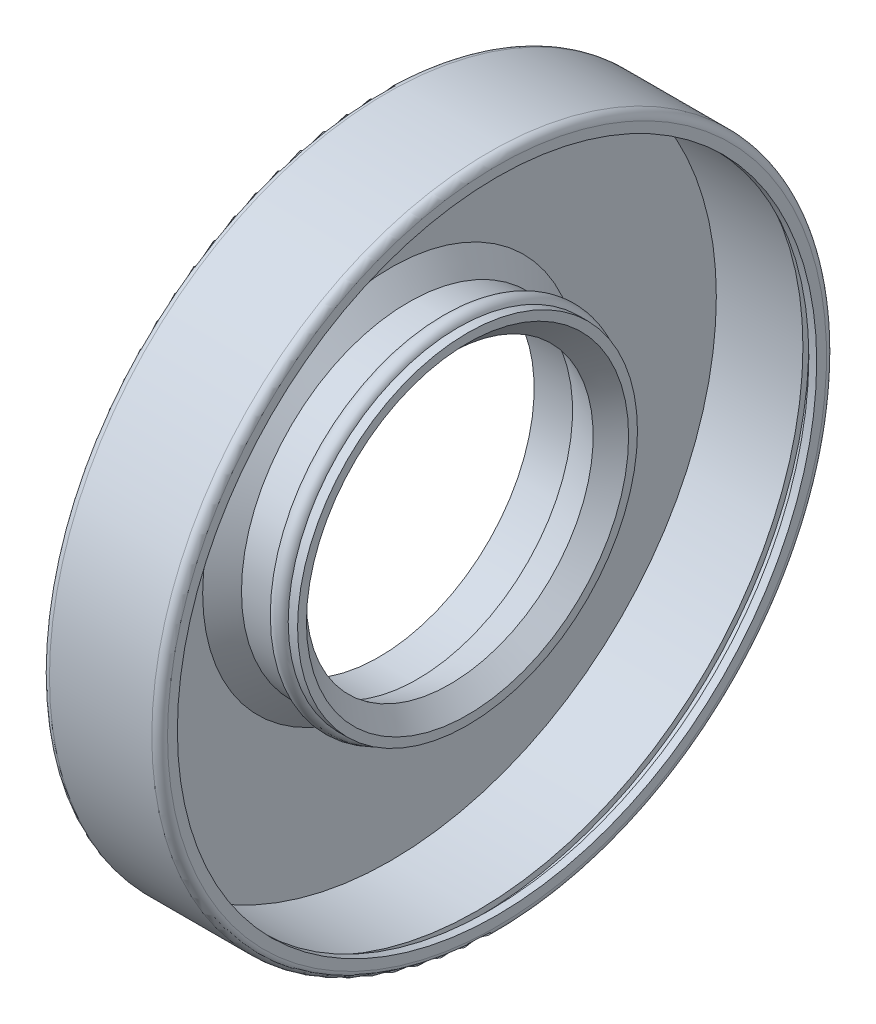
ISO-10303-21;
HEADER;
FILE_DESCRIPTION(('STEP AP214'),'2;1');
FILE_NAME('part.step','',(''),(''),'','','');
FILE_SCHEMA(('AUTOMOTIVE_DESIGN { 1 0 10303 214 1 1 1 1 }'));
ENDSEC;
DATA;
#1=APPLICATION_CONTEXT('core data for automotive mechanical design processes');
#2=APPLICATION_PROTOCOL_DEFINITION('international standard','automotive_design',2000,#1);
#3=PRODUCT_CONTEXT('',#1,'mechanical');
#4=PRODUCT('Part','Part','',(#3));
#5=PRODUCT_RELATED_PRODUCT_CATEGORY('part','',(#4));
#6=PRODUCT_DEFINITION_FORMATION('','',#4);
#7=PRODUCT_DEFINITION_CONTEXT('part definition',#1,'design');
#8=PRODUCT_DEFINITION('design','',#6,#7);
#9=PRODUCT_DEFINITION_SHAPE('','',#8);
#10=(LENGTH_UNIT() NAMED_UNIT(*) SI_UNIT(.MILLI.,.METRE.));
#11=(NAMED_UNIT(*) PLANE_ANGLE_UNIT() SI_UNIT($,.RADIAN.));
#12=(NAMED_UNIT(*) SI_UNIT($,.STERADIAN.) SOLID_ANGLE_UNIT());
#13=UNCERTAINTY_MEASURE_WITH_UNIT(LENGTH_MEASURE(1.E-05),#10,'distance_accuracy_value','');
#14=(GEOMETRIC_REPRESENTATION_CONTEXT(3) GLOBAL_UNCERTAINTY_ASSIGNED_CONTEXT((#13)) GLOBAL_UNIT_ASSIGNED_CONTEXT((#10,
#11,#12)) REPRESENTATION_CONTEXT('',''));
#15=CARTESIAN_POINT('',(0.,0.,0.));
#16=DIRECTION('',(0.,0.,1.));
#17=DIRECTION('',(1.,0.,0.));
#18=AXIS2_PLACEMENT_3D('',#15,#16,#17);
#19=CARTESIAN_POINT('',(0.,0.,-9.2));
#20=DIRECTION('',(1.,0.,0.));
#21=DIRECTION('',(0.,0.,-1.));
#22=AXIS2_PLACEMENT_3D('',#19,#20,#21);
#23=PLANE('',#22);
#24=CARTESIAN_POINT('',(0.,0.,0.));
#25=DIRECTION('',(-1.,0.,0.));
#26=DIRECTION('',(0.,0.,1.));
#27=AXIS2_PLACEMENT_3D('',#24,#25,#26);
#28=CIRCLE('',#27,19.5333333333333);
#29=CARTESIAN_POINT('',(0.,0.,19.5333333333333));
#30=VERTEX_POINT('',#29);
#31=EDGE_CURVE('E70',#30,#30,#28,.T.);
#32=ORIENTED_EDGE('',*,*,#31,.T.);
#33=EDGE_LOOP('',(#32));
#34=FACE_BOUND('',#33,.T.);
#35=CARTESIAN_POINT('',(0.,0.,0.));
#36=DIRECTION('',(1.,0.,0.));
#37=DIRECTION('',(0.,0.,-1.));
#38=AXIS2_PLACEMENT_3D('',#35,#36,#37);
#39=CIRCLE('',#38,9.55);
#40=CARTESIAN_POINT('',(0.,0.,-9.55));
#41=VERTEX_POINT('',#40);
#42=EDGE_CURVE('E10',#41,#41,#39,.F.);
#43=ORIENTED_EDGE('',*,*,#42,.F.);
#44=EDGE_LOOP('',(#43));
#45=FACE_BOUND('',#44,.T.);
#46=ADVANCED_FACE('F32',(#34,#45),#23,.F.);
#47=CARTESIAN_POINT('',(0.,0.,0.));
#48=DIRECTION('',(-1.,0.,0.));
#49=DIRECTION('',(0.,0.,1.));
#50=AXIS2_PLACEMENT_3D('',#47,#48,#49);
#51=CYLINDRICAL_SURFACE('',#50,19.3);
#52=CARTESIAN_POINT('',(5.83333333333334,0.,0.));
#53=DIRECTION('',(-1.,0.,0.));
#54=DIRECTION('',(0.,0.,1.));
#55=AXIS2_PLACEMENT_3D('',#52,#53,#54);
#56=CIRCLE('',#55,19.3);
#57=CARTESIAN_POINT('',(5.83333333333334,0.,19.3));
#58=VERTEX_POINT('',#57);
#59=EDGE_CURVE('E40',#58,#58,#56,.T.);
#60=ORIENTED_EDGE('',*,*,#59,.F.);
#61=EDGE_LOOP('',(#60));
#62=FACE_BOUND('',#61,.T.);
#63=CARTESIAN_POINT('',(0.699999999999999,0.,0.));
#64=DIRECTION('',(-1.,0.,0.));
#65=DIRECTION('',(0.,0.,1.));
#66=AXIS2_PLACEMENT_3D('',#63,#64,#65);
#67=CIRCLE('',#66,19.3);
#68=CARTESIAN_POINT('',(0.699999999999999,0.,19.3));
#69=VERTEX_POINT('',#68);
#70=EDGE_CURVE('E100',#69,#69,#67,.T.);
#71=ORIENTED_EDGE('',*,*,#70,.T.);
#72=EDGE_LOOP('',(#71));
#73=FACE_BOUND('',#72,.T.);
#74=ADVANCED_FACE('F34',(#62,#73),#51,.F.);
#75=CARTESIAN_POINT('',(5.83333333333334,0.,-19.3));
#76=DIRECTION('',(-1.,0.,0.));
#77=DIRECTION('',(0.,0.,1.));
#78=AXIS2_PLACEMENT_3D('',#75,#76,#77);
#79=PLANE('',#78);
#80=CARTESIAN_POINT('',(5.83333333333334,0.,0.));
#81=DIRECTION('',(-1.,0.,0.));
#82=DIRECTION('',(0.,0.,1.));
#83=AXIS2_PLACEMENT_3D('',#80,#81,#82);
#84=CIRCLE('',#83,19.65);
#85=CARTESIAN_POINT('',(5.83333333333334,0.,19.65));
#86=VERTEX_POINT('',#85);
#87=EDGE_CURVE('E46',#86,#86,#84,.T.);
#88=ORIENTED_EDGE('',*,*,#87,.F.);
#89=EDGE_LOOP('',(#88));
#90=FACE_BOUND('',#89,.T.);
#91=ORIENTED_EDGE('',*,*,#59,.T.);
#92=EDGE_LOOP('',(#91));
#93=FACE_BOUND('',#92,.T.);
#94=ADVANCED_FACE('F174',(#90,#93),#79,.F.);
#95=CARTESIAN_POINT('',(0.,0.,0.));
#96=DIRECTION('',(-1.,0.,0.));
#97=DIRECTION('',(0.,0.,1.));
#98=AXIS2_PLACEMENT_3D('',#95,#96,#97);
#99=CYLINDRICAL_SURFACE('',#98,19.65);
#100=CARTESIAN_POINT('',(6.53333333333333,0.,0.));
#101=DIRECTION('',(-1.,0.,0.));
#102=DIRECTION('',(0.,0.,1.));
#103=AXIS2_PLACEMENT_3D('',#100,#101,#102);
#104=CIRCLE('',#103,19.65);
#105=CARTESIAN_POINT('',(6.53333333333333,0.,19.65));
#106=VERTEX_POINT('',#105);
#107=EDGE_CURVE('E50',#106,#106,#104,.T.);
#108=ORIENTED_EDGE('',*,*,#107,.F.);
#109=EDGE_LOOP('',(#108));
#110=FACE_BOUND('',#109,.T.);
#111=ORIENTED_EDGE('',*,*,#87,.T.);
#112=EDGE_LOOP('',(#111));
#113=FACE_BOUND('',#112,.T.);
#114=ADVANCED_FACE('F207',(#110,#113),#99,.F.);
#115=CARTESIAN_POINT('',(6.53333333333333,0.,-19.65));
#116=DIRECTION('',(1.,0.,0.));
#117=DIRECTION('',(0.,0.,-1.));
#118=AXIS2_PLACEMENT_3D('',#115,#116,#117);
#119=PLANE('',#118);
#120=CARTESIAN_POINT('',(6.53333333333333,0.,0.));
#121=DIRECTION('',(-1.,0.,0.));
#122=DIRECTION('',(0.,0.,1.));
#123=AXIS2_PLACEMENT_3D('',#120,#121,#122);
#124=CIRCLE('',#123,18.95);
#125=CARTESIAN_POINT('',(6.53333333333333,0.,18.95));
#126=VERTEX_POINT('',#125);
#127=EDGE_CURVE('E55',#126,#126,#124,.T.);
#128=ORIENTED_EDGE('',*,*,#127,.F.);
#129=EDGE_LOOP('',(#128));
#130=FACE_BOUND('',#129,.T.);
#131=ORIENTED_EDGE('',*,*,#107,.T.);
#132=EDGE_LOOP('',(#131));
#133=FACE_BOUND('',#132,.T.);
#134=ADVANCED_FACE('F201',(#130,#133),#119,.F.);
#135=CARTESIAN_POINT('',(0.,0.,0.));
#136=DIRECTION('',(-1.,0.,0.));
#137=DIRECTION('',(0.,0.,1.));
#138=AXIS2_PLACEMENT_3D('',#135,#136,#137);
#139=CYLINDRICAL_SURFACE('',#138,18.95);
#140=CARTESIAN_POINT('',(7.,0.,0.));
#141=DIRECTION('',(-1.,0.,0.));
#142=DIRECTION('',(0.,0.,1.));
#143=AXIS2_PLACEMENT_3D('',#140,#141,#142);
#144=CIRCLE('',#143,18.95);
#145=CARTESIAN_POINT('',(7.,0.,18.95));
#146=VERTEX_POINT('',#145);
#147=EDGE_CURVE('E58',#146,#146,#144,.T.);
#148=ORIENTED_EDGE('',*,*,#147,.F.);
#149=EDGE_LOOP('',(#148));
#150=FACE_BOUND('',#149,.T.);
#151=ORIENTED_EDGE('',*,*,#127,.T.);
#152=EDGE_LOOP('',(#151));
#153=FACE_BOUND('',#152,.T.);
#154=ADVANCED_FACE('F195',(#150,#153),#139,.F.);
#155=CARTESIAN_POINT('',(7.,0.,-18.95));
#156=DIRECTION('',(-1.,0.,0.));
#157=DIRECTION('',(0.,0.,1.));
#158=AXIS2_PLACEMENT_3D('',#155,#156,#157);
#159=PLANE('',#158);
#160=CARTESIAN_POINT('',(7.,0.,0.));
#161=DIRECTION('',(-1.,0.,0.));
#162=DIRECTION('',(0.,0.,1.));
#163=AXIS2_PLACEMENT_3D('',#160,#161,#162);
#164=CIRCLE('',#163,19.5333333333333);
#165=CARTESIAN_POINT('',(7.,0.,19.5333333333333));
#166=VERTEX_POINT('',#165);
#167=EDGE_CURVE('E61',#166,#166,#164,.T.);
#168=ORIENTED_EDGE('',*,*,#167,.F.);
#169=EDGE_LOOP('',(#168));
#170=FACE_BOUND('',#169,.T.);
#171=ORIENTED_EDGE('',*,*,#147,.T.);
#172=EDGE_LOOP('',(#171));
#173=FACE_BOUND('',#172,.T.);
#174=ADVANCED_FACE('F189',(#170,#173),#159,.F.);
#175=CARTESIAN_POINT('',(6.53333333333333,0.,0.));
#176=DIRECTION('',(-1.,0.,0.));
#177=DIRECTION('',(0.,0.,1.));
#178=AXIS2_PLACEMENT_3D('',#175,#176,#177);
#179=TOROIDAL_SURFACE('',#178,19.5333333333333,0.466666666666669);
#180=CARTESIAN_POINT('',(6.53333333333333,0.,0.));
#181=DIRECTION('',(-1.,0.,0.));
#182=DIRECTION('',(0.,0.,1.));
#183=AXIS2_PLACEMENT_3D('',#180,#181,#182);
#184=CIRCLE('',#183,20.);
#185=CARTESIAN_POINT('',(6.53333333333333,0.,20.));
#186=VERTEX_POINT('',#185);
#187=EDGE_CURVE('E64',#186,#186,#184,.T.);
#188=ORIENTED_EDGE('',*,*,#187,.F.);
#189=EDGE_LOOP('',(#188));
#190=FACE_BOUND('',#189,.T.);
#191=ORIENTED_EDGE('',*,*,#167,.T.);
#192=EDGE_LOOP('',(#191));
#193=FACE_BOUND('',#192,.T.);
#194=ADVANCED_FACE('F183',(#190,#193),#179,.T.);
#195=CARTESIAN_POINT('',(0.,0.,0.));
#196=DIRECTION('',(-1.,0.,0.));
#197=DIRECTION('',(0.,0.,1.));
#198=AXIS2_PLACEMENT_3D('',#195,#196,#197);
#199=CYLINDRICAL_SURFACE('',#198,20.);
#200=CARTESIAN_POINT('',(0.466666666666664,0.,0.));
#201=DIRECTION('',(-1.,0.,0.));
#202=DIRECTION('',(0.,0.,1.));
#203=AXIS2_PLACEMENT_3D('',#200,#201,#202);
#204=CIRCLE('',#203,20.);
#205=CARTESIAN_POINT('',(0.466666666666664,0.,20.));
#206=VERTEX_POINT('',#205);
#207=EDGE_CURVE('E67',#206,#206,#204,.T.);
#208=ORIENTED_EDGE('',*,*,#207,.F.);
#209=EDGE_LOOP('',(#208));
#210=FACE_BOUND('',#209,.T.);
#211=ORIENTED_EDGE('',*,*,#187,.T.);
#212=EDGE_LOOP('',(#211));
#213=FACE_BOUND('',#212,.T.);
#214=ADVANCED_FACE('F166',(#210,#213),#199,.T.);
#215=CARTESIAN_POINT('',(0.466666666666664,0.,0.));
#216=DIRECTION('',(-1.,0.,0.));
#217=DIRECTION('',(0.,0.,1.));
#218=AXIS2_PLACEMENT_3D('',#215,#216,#217);
#219=TOROIDAL_SURFACE('',#218,19.5333333333333,0.466666666666665);
#220=ORIENTED_EDGE('',*,*,#31,.F.);
#221=EDGE_LOOP('',(#220));
#222=FACE_BOUND('',#221,.T.);
#223=ORIENTED_EDGE('',*,*,#207,.T.);
#224=EDGE_LOOP('',(#223));
#225=FACE_BOUND('',#224,.T.);
#226=ADVANCED_FACE('F161',(#222,#225),#219,.T.);
#227=ORIENTED_EDGE('',*,*,#42,.T.);
#228=EDGE_LOOP('',(#227));
#229=FACE_BOUND('',#228,.T.);
#230=CARTESIAN_POINT('',(0.,0.,0.));
#231=DIRECTION('',(-1.,0.,0.));
#232=DIRECTION('',(0.,0.,1.));
#233=AXIS2_PLACEMENT_3D('',#230,#231,#232);
#234=CIRCLE('',#233,9.2);
#235=CARTESIAN_POINT('',(0.,0.,9.2));
#236=VERTEX_POINT('',#235);
#237=EDGE_CURVE('E73',#236,#236,#234,.T.);
#238=ORIENTED_EDGE('',*,*,#237,.F.);
#239=EDGE_LOOP('',(#238));
#240=FACE_BOUND('',#239,.T.);
#241=ADVANCED_FACE('F156',(#229,#240),#23,.F.);
#242=CARTESIAN_POINT('',(0.,0.,0.));
#243=DIRECTION('',(-1.,0.,0.));
#244=DIRECTION('',(0.,0.,1.));
#245=AXIS2_PLACEMENT_3D('',#242,#243,#244);
#246=CYLINDRICAL_SURFACE('',#245,9.2);
#247=CARTESIAN_POINT('',(2.27676580638177,0.,0.));
#248=DIRECTION('',(-1.,0.,0.));
#249=DIRECTION('',(0.,0.,1.));
#250=AXIS2_PLACEMENT_3D('',#247,#248,#249);
#251=CIRCLE('',#250,9.2);
#252=CARTESIAN_POINT('',(2.27676580638177,0.,9.2));
#253=VERTEX_POINT('',#252);
#254=EDGE_CURVE('E76',#253,#253,#251,.T.);
#255=ORIENTED_EDGE('',*,*,#254,.F.);
#256=EDGE_LOOP('',(#255));
#257=FACE_BOUND('',#256,.T.);
#258=ORIENTED_EDGE('',*,*,#237,.T.);
#259=EDGE_LOOP('',(#258));
#260=FACE_BOUND('',#259,.T.);
#261=ADVANCED_FACE('F150',(#257,#260),#246,.F.);
#262=CARTESIAN_POINT('',(2.27676580638177,0.,0.));
#263=DIRECTION('',(-1.,0.,0.));
#264=DIRECTION('',(0.,0.,1.));
#265=AXIS2_PLACEMENT_3D('',#262,#263,#264);
#266=CONICAL_SURFACE('',#265,9.2,0.349065850398866);
#267=CARTESIAN_POINT('',(4.2,0.,0.));
#268=DIRECTION('',(-1.,0.,0.));
#269=DIRECTION('',(0.,0.,1.));
#270=AXIS2_PLACEMENT_3D('',#267,#268,#269);
#271=CIRCLE('',#270,8.5);
#272=CARTESIAN_POINT('',(4.2,0.,8.5));
#273=VERTEX_POINT('',#272);
#274=EDGE_CURVE('E79',#273,#273,#271,.T.);
#275=ORIENTED_EDGE('',*,*,#274,.F.);
#276=EDGE_LOOP('',(#275));
#277=FACE_BOUND('',#276,.T.);
#278=ORIENTED_EDGE('',*,*,#254,.T.);
#279=EDGE_LOOP('',(#278));
#280=FACE_BOUND('',#279,.T.);
#281=ADVANCED_FACE('F144',(#277,#280),#266,.F.);
#282=CARTESIAN_POINT('',(4.2,0.,0.));
#283=DIRECTION('',(1.,0.,0.));
#284=DIRECTION('',(0.,0.,-1.));
#285=AXIS2_PLACEMENT_3D('',#282,#283,#284);
#286=CONICAL_SURFACE('',#285,8.5,0.78539816339745);
#287=CARTESIAN_POINT('',(5.25,0.,0.));
#288=DIRECTION('',(-1.,0.,0.));
#289=DIRECTION('',(0.,0.,1.));
#290=AXIS2_PLACEMENT_3D('',#287,#288,#289);
#291=CIRCLE('',#290,9.55);
#292=CARTESIAN_POINT('',(5.25,0.,9.55));
#293=VERTEX_POINT('',#292);
#294=EDGE_CURVE('E82',#293,#293,#291,.T.);
#295=ORIENTED_EDGE('',*,*,#294,.F.);
#296=EDGE_LOOP('',(#295));
#297=FACE_BOUND('',#296,.T.);
#298=ORIENTED_EDGE('',*,*,#274,.T.);
#299=EDGE_LOOP('',(#298));
#300=FACE_BOUND('',#299,.T.);
#301=ADVANCED_FACE('F138',(#297,#300),#286,.F.);
#302=CARTESIAN_POINT('',(5.25,0.,-9.55));
#303=DIRECTION('',(-1.,0.,0.));
#304=DIRECTION('',(0.,0.,1.));
#305=AXIS2_PLACEMENT_3D('',#302,#303,#304);
#306=PLANE('',#305);
#307=CARTESIAN_POINT('',(5.25,0.,0.));
#308=DIRECTION('',(-1.,0.,0.));
#309=DIRECTION('',(0.,0.,1.));
#310=AXIS2_PLACEMENT_3D('',#307,#308,#309);
#311=CIRCLE('',#310,10.075);
#312=CARTESIAN_POINT('',(5.25,0.,10.075));
#313=VERTEX_POINT('',#312);
#314=EDGE_CURVE('E85',#313,#313,#311,.T.);
#315=ORIENTED_EDGE('',*,*,#314,.F.);
#316=EDGE_LOOP('',(#315));
#317=FACE_BOUND('',#316,.T.);
#318=ORIENTED_EDGE('',*,*,#294,.T.);
#319=EDGE_LOOP('',(#318));
#320=FACE_BOUND('',#319,.T.);
#321=ADVANCED_FACE('F132',(#317,#320),#306,.F.);
#322=CARTESIAN_POINT('',(0.,0.,0.));
#323=DIRECTION('',(-1.,0.,0.));
#324=DIRECTION('',(0.,0.,1.));
#325=AXIS2_PLACEMENT_3D('',#322,#323,#324);
#326=CYLINDRICAL_SURFACE('',#325,10.075);
#327=CARTESIAN_POINT('',(4.69497474683058,0.,0.));
#328=DIRECTION('',(-1.,0.,0.));
#329=DIRECTION('',(0.,0.,1.));
#330=AXIS2_PLACEMENT_3D('',#327,#328,#329);
#331=CIRCLE('',#330,10.075);
#332=CARTESIAN_POINT('',(4.69497474683058,0.,10.075));
#333=VERTEX_POINT('',#332);
#334=EDGE_CURVE('E88',#333,#333,#331,.T.);
#335=ORIENTED_EDGE('',*,*,#334,.F.);
#336=EDGE_LOOP('',(#335));
#337=FACE_BOUND('',#336,.T.);
#338=ORIENTED_EDGE('',*,*,#314,.T.);
#339=EDGE_LOOP('',(#338));
#340=FACE_BOUND('',#339,.T.);
#341=ADVANCED_FACE('F126',(#337,#340),#326,.T.);
#342=CARTESIAN_POINT('',(4.2,0.,0.));
#343=DIRECTION('',(-1.,0.,0.));
#344=DIRECTION('',(0.,0.,1.));
#345=AXIS2_PLACEMENT_3D('',#342,#343,#344);
#346=TOROIDAL_SURFACE('',#345,9.9,0.525);
#347=CARTESIAN_POINT('',(3.675,0.,0.));
#348=DIRECTION('',(-1.,0.,0.));
#349=DIRECTION('',(0.,0.,1.));
#350=AXIS2_PLACEMENT_3D('',#347,#348,#349);
#351=CIRCLE('',#350,9.9);
#352=CARTESIAN_POINT('',(3.675,0.,9.9));
#353=VERTEX_POINT('',#352);
#354=EDGE_CURVE('E91',#353,#353,#351,.T.);
#355=ORIENTED_EDGE('',*,*,#354,.F.);
#356=EDGE_LOOP('',(#355));
#357=FACE_BOUND('',#356,.T.);
#358=ORIENTED_EDGE('',*,*,#334,.T.);
#359=EDGE_LOOP('',(#358));
#360=FACE_BOUND('',#359,.T.);
#361=ADVANCED_FACE('F120',(#357,#360),#346,.T.);
#362=CARTESIAN_POINT('',(0.,0.,0.));
#363=DIRECTION('',(-1.,0.,0.));
#364=DIRECTION('',(0.,0.,1.));
#365=AXIS2_PLACEMENT_3D('',#362,#363,#364);
#366=CYLINDRICAL_SURFACE('',#365,9.9);
#367=CARTESIAN_POINT('',(1.75,0.,0.));
#368=DIRECTION('',(-1.,0.,0.));
#369=DIRECTION('',(0.,0.,1.));
#370=AXIS2_PLACEMENT_3D('',#367,#368,#369);
#371=CIRCLE('',#370,9.9);
#372=CARTESIAN_POINT('',(1.75,0.,9.9));
#373=VERTEX_POINT('',#372);
#374=EDGE_CURVE('E94',#373,#373,#371,.T.);
#375=ORIENTED_EDGE('',*,*,#374,.F.);
#376=EDGE_LOOP('',(#375));
#377=FACE_BOUND('',#376,.T.);
#378=ORIENTED_EDGE('',*,*,#354,.T.);
#379=EDGE_LOOP('',(#378));
#380=FACE_BOUND('',#379,.T.);
#381=ADVANCED_FACE('F114',(#377,#380),#366,.T.);
#382=CARTESIAN_POINT('',(1.75,0.,0.));
#383=DIRECTION('',(-1.,0.,0.));
#384=DIRECTION('',(0.,0.,1.));
#385=AXIS2_PLACEMENT_3D('',#382,#383,#384);
#386=CONICAL_SURFACE('',#385,9.9,0.872664625997167);
#387=CARTESIAN_POINT('',(0.700000000000006,0.,0.));
#388=DIRECTION('',(-1.,0.,0.));
#389=DIRECTION('',(0.,0.,1.));
#390=AXIS2_PLACEMENT_3D('',#387,#388,#389);
#391=CIRCLE('',#390,11.1513412722239);
#392=CARTESIAN_POINT('',(0.700000000000006,0.,11.1513412722239));
#393=VERTEX_POINT('',#392);
#394=EDGE_CURVE('E97',#393,#393,#391,.T.);
#395=ORIENTED_EDGE('',*,*,#394,.F.);
#396=EDGE_LOOP('',(#395));
#397=FACE_BOUND('',#396,.T.);
#398=ORIENTED_EDGE('',*,*,#374,.T.);
#399=EDGE_LOOP('',(#398));
#400=FACE_BOUND('',#399,.T.);
#401=ADVANCED_FACE('F108',(#397,#400),#386,.T.);
#402=CARTESIAN_POINT('',(0.699999999999999,0.,-19.3));
#403=DIRECTION('',(-1.,0.,0.));
#404=DIRECTION('',(0.,0.,1.));
#405=AXIS2_PLACEMENT_3D('',#402,#403,#404);
#406=PLANE('',#405);
#407=ORIENTED_EDGE('',*,*,#70,.F.);
#408=EDGE_LOOP('',(#407));
#409=FACE_BOUND('',#408,.T.);
#410=ORIENTED_EDGE('',*,*,#394,.T.);
#411=EDGE_LOOP('',(#410));
#412=FACE_BOUND('',#411,.T.);
#413=ADVANCED_FACE('F105',(#409,#412),#406,.F.);
#414=CLOSED_SHELL('',(#46,#74,#94,#114,#134,#154,#174,#194,#214,#226,#241,#261,#281,#301,#321,
#341,#361,#381,#401,#413));
#415=MANIFOLD_SOLID_BREP('B2',#414);
#416=ADVANCED_BREP_SHAPE_REPRESENTATION('',(#18,#415),#14);
#417=SHAPE_DEFINITION_REPRESENTATION(#9,#416);
ENDSEC;
END-ISO-10303-21;
